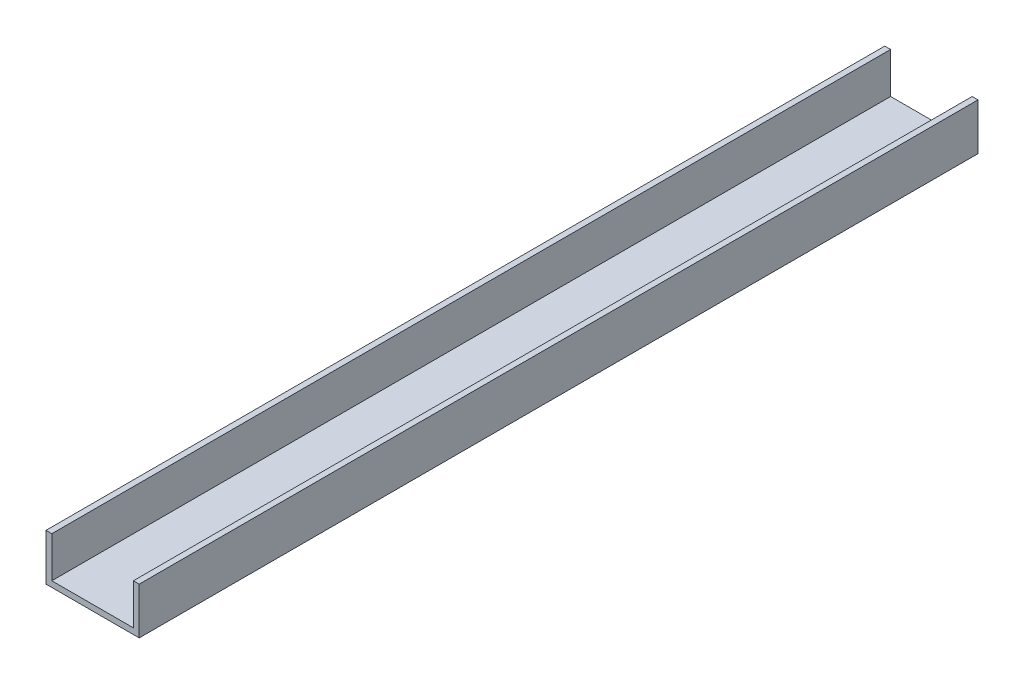
ISO-10303-21;
HEADER;
FILE_DESCRIPTION(('STEP AP214'),'2;1');
FILE_NAME('part.step','',(''),(''),'','','');
FILE_SCHEMA(('AUTOMOTIVE_DESIGN { 1 0 10303 214 1 1 1 1 }'));
ENDSEC;
DATA;
#1=APPLICATION_CONTEXT('core data for automotive mechanical design processes');
#2=APPLICATION_PROTOCOL_DEFINITION('international standard','automotive_design',2000,#1);
#3=PRODUCT_CONTEXT('',#1,'mechanical');
#4=PRODUCT('Part','Part','',(#3));
#5=PRODUCT_RELATED_PRODUCT_CATEGORY('part','',(#4));
#6=PRODUCT_DEFINITION_FORMATION('','',#4);
#7=PRODUCT_DEFINITION_CONTEXT('part definition',#1,'design');
#8=PRODUCT_DEFINITION('design','',#6,#7);
#9=PRODUCT_DEFINITION_SHAPE('','',#8);
#10=(LENGTH_UNIT() NAMED_UNIT(*) SI_UNIT(.MILLI.,.METRE.));
#11=(NAMED_UNIT(*) PLANE_ANGLE_UNIT() SI_UNIT($,.RADIAN.));
#12=(NAMED_UNIT(*) SI_UNIT($,.STERADIAN.) SOLID_ANGLE_UNIT());
#13=UNCERTAINTY_MEASURE_WITH_UNIT(LENGTH_MEASURE(1.E-05),#10,'distance_accuracy_value','');
#14=(GEOMETRIC_REPRESENTATION_CONTEXT(3) GLOBAL_UNCERTAINTY_ASSIGNED_CONTEXT((#13)) GLOBAL_UNIT_ASSIGNED_CONTEXT((#10,
#11,#12)) REPRESENTATION_CONTEXT('',''));
#15=CARTESIAN_POINT('',(0.,0.,0.));
#16=DIRECTION('',(0.,0.,1.));
#17=DIRECTION('',(1.,0.,0.));
#18=AXIS2_PLACEMENT_3D('',#15,#16,#17);
#19=CARTESIAN_POINT('',(0.,0.,457.2));
#20=DIRECTION('',(1.,0.,0.));
#21=DIRECTION('',(0.,0.,-1.));
#22=AXIS2_PLACEMENT_3D('',#19,#20,#21);
#23=PLANE('',#22);
#24=DIRECTION('',(0.,-1.,0.));
#25=VECTOR('',#24,1.);
#26=CARTESIAN_POINT('',(0.,0.,0.));
#27=LINE('',#26,#25);
#28=CARTESIAN_POINT('',(0.,25.4,0.));
#29=VERTEX_POINT('',#28);
#30=CARTESIAN_POINT('',(0.,0.,0.));
#31=VERTEX_POINT('',#30);
#32=EDGE_CURVE('E150',#29,#31,#27,.T.);
#33=ORIENTED_EDGE('',*,*,#32,.T.);
#34=DIRECTION('',(0.,0.,-1.));
#35=VECTOR('',#34,1.);
#36=CARTESIAN_POINT('',(0.,0.,457.2));
#37=LINE('',#36,#35);
#38=CARTESIAN_POINT('',(0.,0.,457.2));
#39=VERTEX_POINT('',#38);
#40=EDGE_CURVE('E11',#39,#31,#37,.T.);
#41=ORIENTED_EDGE('',*,*,#40,.F.);
#42=DIRECTION('',(0.,-1.,0.));
#43=VECTOR('',#42,1.);
#44=CARTESIAN_POINT('',(0.,0.,457.2));
#45=LINE('',#44,#43);
#46=CARTESIAN_POINT('',(0.,25.4,457.2));
#47=VERTEX_POINT('',#46);
#48=EDGE_CURVE('E169',#47,#39,#45,.T.);
#49=ORIENTED_EDGE('',*,*,#48,.F.);
#50=DIRECTION('',(0.,0.,-1.));
#51=VECTOR('',#50,1.);
#52=CARTESIAN_POINT('',(0.,25.4,457.2));
#53=LINE('',#52,#51);
#54=EDGE_CURVE('E146',#47,#29,#53,.T.);
#55=ORIENTED_EDGE('',*,*,#54,.T.);
#56=EDGE_LOOP('',(#33,#41,#49,#55));
#57=FACE_BOUND('',#56,.T.);
#58=ADVANCED_FACE('F40',(#57),#23,.F.);
#59=CARTESIAN_POINT('',(0.,0.,457.2));
#60=DIRECTION('',(0.,1.,0.));
#61=DIRECTION('',(0.,0.,1.));
#62=AXIS2_PLACEMENT_3D('',#59,#60,#61);
#63=PLANE('',#62);
#64=DIRECTION('',(1.,0.,0.));
#65=VECTOR('',#64,1.);
#66=CARTESIAN_POINT('',(0.,0.,0.));
#67=LINE('',#66,#65);
#68=CARTESIAN_POINT('',(50.8,0.,0.));
#69=VERTEX_POINT('',#68);
#70=EDGE_CURVE('E153',#31,#69,#67,.T.);
#71=ORIENTED_EDGE('',*,*,#70,.T.);
#72=DIRECTION('',(0.,0.,-1.));
#73=VECTOR('',#72,1.);
#74=CARTESIAN_POINT('',(50.8,0.,457.2));
#75=LINE('',#74,#73);
#76=CARTESIAN_POINT('',(50.8,0.,457.2));
#77=VERTEX_POINT('',#76);
#78=EDGE_CURVE('E49',#77,#69,#75,.T.);
#79=ORIENTED_EDGE('',*,*,#78,.F.);
#80=DIRECTION('',(1.,0.,0.));
#81=VECTOR('',#80,1.);
#82=CARTESIAN_POINT('',(0.,0.,457.2));
#83=LINE('',#82,#81);
#84=EDGE_CURVE('E106',#39,#77,#83,.T.);
#85=ORIENTED_EDGE('',*,*,#84,.F.);
#86=ORIENTED_EDGE('',*,*,#40,.T.);
#87=EDGE_LOOP('',(#71,#79,#85,#86));
#88=FACE_BOUND('',#87,.T.);
#89=ADVANCED_FACE('F213',(#88),#63,.F.);
#90=CARTESIAN_POINT('',(50.8,0.,457.2));
#91=DIRECTION('',(-1.,0.,0.));
#92=DIRECTION('',(0.,0.,1.));
#93=AXIS2_PLACEMENT_3D('',#90,#91,#92);
#94=PLANE('',#93);
#95=DIRECTION('',(0.,1.,0.));
#96=VECTOR('',#95,1.);
#97=CARTESIAN_POINT('',(50.8,0.,0.));
#98=LINE('',#97,#96);
#99=CARTESIAN_POINT('',(50.8,25.4,0.));
#100=VERTEX_POINT('',#99);
#101=EDGE_CURVE('E156',#69,#100,#98,.T.);
#102=ORIENTED_EDGE('',*,*,#101,.T.);
#103=DIRECTION('',(0.,0.,-1.));
#104=VECTOR('',#103,1.);
#105=CARTESIAN_POINT('',(50.8,25.4,457.2));
#106=LINE('',#105,#104);
#107=CARTESIAN_POINT('',(50.8,25.4,457.2));
#108=VERTEX_POINT('',#107);
#109=EDGE_CURVE('E180',#108,#100,#106,.T.);
#110=ORIENTED_EDGE('',*,*,#109,.F.);
#111=DIRECTION('',(0.,1.,0.));
#112=VECTOR('',#111,1.);
#113=CARTESIAN_POINT('',(50.8,0.,457.2));
#114=LINE('',#113,#112);
#115=EDGE_CURVE('E190',#77,#108,#114,.T.);
#116=ORIENTED_EDGE('',*,*,#115,.F.);
#117=ORIENTED_EDGE('',*,*,#78,.T.);
#118=EDGE_LOOP('',(#102,#110,#116,#117));
#119=FACE_BOUND('',#118,.T.);
#120=ADVANCED_FACE('F188',(#119),#94,.F.);
#121=CARTESIAN_POINT('',(47.625,25.4,457.2));
#122=DIRECTION('',(0.,-1.,0.));
#123=DIRECTION('',(0.,0.,-1.));
#124=AXIS2_PLACEMENT_3D('',#121,#122,#123);
#125=PLANE('',#124);
#126=DIRECTION('',(-1.,0.,0.));
#127=VECTOR('',#126,1.);
#128=CARTESIAN_POINT('',(47.625,25.4,0.));
#129=LINE('',#128,#127);
#130=CARTESIAN_POINT('',(47.625,25.4,0.));
#131=VERTEX_POINT('',#130);
#132=EDGE_CURVE('E159',#100,#131,#129,.T.);
#133=ORIENTED_EDGE('',*,*,#132,.T.);
#134=DIRECTION('',(0.,0.,-1.));
#135=VECTOR('',#134,1.);
#136=CARTESIAN_POINT('',(47.625,25.4,457.2));
#137=LINE('',#136,#135);
#138=CARTESIAN_POINT('',(47.625,25.4,457.2));
#139=VERTEX_POINT('',#138);
#140=EDGE_CURVE('E176',#139,#131,#137,.T.);
#141=ORIENTED_EDGE('',*,*,#140,.F.);
#142=DIRECTION('',(-1.,0.,0.));
#143=VECTOR('',#142,1.);
#144=CARTESIAN_POINT('',(47.625,25.4,457.2));
#145=LINE('',#144,#143);
#146=EDGE_CURVE('E203',#108,#139,#145,.T.);
#147=ORIENTED_EDGE('',*,*,#146,.F.);
#148=ORIENTED_EDGE('',*,*,#109,.T.);
#149=EDGE_LOOP('',(#133,#141,#147,#148));
#150=FACE_BOUND('',#149,.T.);
#151=ADVANCED_FACE('F198',(#150),#125,.F.);
#152=CARTESIAN_POINT('',(47.625,3.175,457.2));
#153=DIRECTION('',(1.,0.,0.));
#154=DIRECTION('',(0.,0.,-1.));
#155=AXIS2_PLACEMENT_3D('',#152,#153,#154);
#156=PLANE('',#155);
#157=DIRECTION('',(0.,-1.,0.));
#158=VECTOR('',#157,1.);
#159=CARTESIAN_POINT('',(47.625,3.175,0.));
#160=LINE('',#159,#158);
#161=CARTESIAN_POINT('',(47.625,3.175,0.));
#162=VERTEX_POINT('',#161);
#163=EDGE_CURVE('E162',#131,#162,#160,.T.);
#164=ORIENTED_EDGE('',*,*,#163,.T.);
#165=DIRECTION('',(0.,0.,-1.));
#166=VECTOR('',#165,1.);
#167=CARTESIAN_POINT('',(47.625,3.175,457.2));
#168=LINE('',#167,#166);
#169=CARTESIAN_POINT('',(47.625,3.175,457.2));
#170=VERTEX_POINT('',#169);
#171=EDGE_CURVE('E138',#170,#162,#168,.T.);
#172=ORIENTED_EDGE('',*,*,#171,.F.);
#173=DIRECTION('',(0.,-1.,0.));
#174=VECTOR('',#173,1.);
#175=CARTESIAN_POINT('',(47.625,3.175,457.2));
#176=LINE('',#175,#174);
#177=EDGE_CURVE('E127',#139,#170,#176,.T.);
#178=ORIENTED_EDGE('',*,*,#177,.F.);
#179=ORIENTED_EDGE('',*,*,#140,.T.);
#180=EDGE_LOOP('',(#164,#172,#178,#179));
#181=FACE_BOUND('',#180,.T.);
#182=ADVANCED_FACE('F201',(#181),#156,.F.);
#183=CARTESIAN_POINT('',(3.175,3.175,457.2));
#184=DIRECTION('',(0.,-1.,0.));
#185=DIRECTION('',(0.,0.,-1.));
#186=AXIS2_PLACEMENT_3D('',#183,#184,#185);
#187=PLANE('',#186);
#188=DIRECTION('',(-1.,0.,0.));
#189=VECTOR('',#188,1.);
#190=CARTESIAN_POINT('',(3.175,3.175,0.));
#191=LINE('',#190,#189);
#192=CARTESIAN_POINT('',(3.175,3.175,0.));
#193=VERTEX_POINT('',#192);
#194=EDGE_CURVE('E136',#162,#193,#191,.T.);
#195=ORIENTED_EDGE('',*,*,#194,.T.);
#196=DIRECTION('',(0.,0.,-1.));
#197=VECTOR('',#196,1.);
#198=CARTESIAN_POINT('',(3.175,3.175,457.2));
#199=LINE('',#198,#197);
#200=CARTESIAN_POINT('',(3.175,3.175,457.2));
#201=VERTEX_POINT('',#200);
#202=EDGE_CURVE('E133',#201,#193,#199,.T.);
#203=ORIENTED_EDGE('',*,*,#202,.F.);
#204=DIRECTION('',(-1.,0.,0.));
#205=VECTOR('',#204,1.);
#206=CARTESIAN_POINT('',(3.175,3.175,457.2));
#207=LINE('',#206,#205);
#208=EDGE_CURVE('E121',#170,#201,#207,.T.);
#209=ORIENTED_EDGE('',*,*,#208,.F.);
#210=ORIENTED_EDGE('',*,*,#171,.T.);
#211=EDGE_LOOP('',(#195,#203,#209,#210));
#212=FACE_BOUND('',#211,.T.);
#213=ADVANCED_FACE('F134',(#212),#187,.F.);
#214=CARTESIAN_POINT('',(3.175,3.175,457.2));
#215=DIRECTION('',(-1.,0.,0.));
#216=DIRECTION('',(0.,-1.,0.));
#217=AXIS2_PLACEMENT_3D('',#214,#215,#216);
#218=PLANE('',#217);
#219=DIRECTION('',(0.,1.,0.));
#220=VECTOR('',#219,1.);
#221=CARTESIAN_POINT('',(3.175,3.175,0.));
#222=LINE('',#221,#220);
#223=CARTESIAN_POINT('',(3.175,25.4,0.));
#224=VERTEX_POINT('',#223);
#225=EDGE_CURVE('E92',#193,#224,#222,.T.);
#226=ORIENTED_EDGE('',*,*,#225,.T.);
#227=DIRECTION('',(0.,0.,-1.));
#228=VECTOR('',#227,1.);
#229=CARTESIAN_POINT('',(3.175,25.4,457.2));
#230=LINE('',#229,#228);
#231=CARTESIAN_POINT('',(3.175,25.4,457.2));
#232=VERTEX_POINT('',#231);
#233=EDGE_CURVE('E139',#232,#224,#230,.T.);
#234=ORIENTED_EDGE('',*,*,#233,.F.);
#235=DIRECTION('',(0.,1.,0.));
#236=VECTOR('',#235,1.);
#237=CARTESIAN_POINT('',(3.175,3.175,457.2));
#238=LINE('',#237,#236);
#239=EDGE_CURVE('E125',#201,#232,#238,.T.);
#240=ORIENTED_EDGE('',*,*,#239,.F.);
#241=ORIENTED_EDGE('',*,*,#202,.T.);
#242=EDGE_LOOP('',(#226,#234,#240,#241));
#243=FACE_BOUND('',#242,.T.);
#244=ADVANCED_FACE('F141',(#243),#218,.F.);
#245=CARTESIAN_POINT('',(0.,25.4,457.2));
#246=DIRECTION('',(0.,-1.,0.));
#247=DIRECTION('',(0.,0.,-1.));
#248=AXIS2_PLACEMENT_3D('',#245,#246,#247);
#249=PLANE('',#248);
#250=DIRECTION('',(-1.,0.,0.));
#251=VECTOR('',#250,1.);
#252=CARTESIAN_POINT('',(0.,25.4,0.));
#253=LINE('',#252,#251);
#254=EDGE_CURVE('E98',#224,#29,#253,.T.);
#255=ORIENTED_EDGE('',*,*,#254,.T.);
#256=ORIENTED_EDGE('',*,*,#54,.F.);
#257=DIRECTION('',(-1.,0.,0.));
#258=VECTOR('',#257,1.);
#259=CARTESIAN_POINT('',(0.,25.4,457.2));
#260=LINE('',#259,#258);
#261=EDGE_CURVE('E59',#232,#47,#260,.T.);
#262=ORIENTED_EDGE('',*,*,#261,.F.);
#263=ORIENTED_EDGE('',*,*,#233,.T.);
#264=EDGE_LOOP('',(#255,#256,#262,#263));
#265=FACE_BOUND('',#264,.T.);
#266=ADVANCED_FACE('F229',(#265),#249,.F.);
#267=CARTESIAN_POINT('',(0.,0.,457.2));
#268=DIRECTION('',(0.,0.,-1.));
#269=DIRECTION('',(-1.,0.,0.));
#270=AXIS2_PLACEMENT_3D('',#267,#268,#269);
#271=PLANE('',#270);
#272=ORIENTED_EDGE('',*,*,#48,.T.);
#273=ORIENTED_EDGE('',*,*,#84,.T.);
#274=ORIENTED_EDGE('',*,*,#115,.T.);
#275=ORIENTED_EDGE('',*,*,#146,.T.);
#276=ORIENTED_EDGE('',*,*,#177,.T.);
#277=ORIENTED_EDGE('',*,*,#208,.T.);
#278=ORIENTED_EDGE('',*,*,#239,.T.);
#279=ORIENTED_EDGE('',*,*,#261,.T.);
#280=EDGE_LOOP('',(#272,#273,#274,#275,#276,#277,#278,#279));
#281=FACE_BOUND('',#280,.T.);
#282=ADVANCED_FACE('F123',(#281),#271,.F.);
#283=CARTESIAN_POINT('',(0.,0.,0.));
#284=DIRECTION('',(0.,0.,-1.));
#285=DIRECTION('',(-1.,0.,0.));
#286=AXIS2_PLACEMENT_3D('',#283,#284,#285);
#287=PLANE('',#286);
#288=ORIENTED_EDGE('',*,*,#32,.F.);
#289=ORIENTED_EDGE('',*,*,#254,.F.);
#290=ORIENTED_EDGE('',*,*,#225,.F.);
#291=ORIENTED_EDGE('',*,*,#194,.F.);
#292=ORIENTED_EDGE('',*,*,#163,.F.);
#293=ORIENTED_EDGE('',*,*,#132,.F.);
#294=ORIENTED_EDGE('',*,*,#101,.F.);
#295=ORIENTED_EDGE('',*,*,#70,.F.);
#296=EDGE_LOOP('',(#288,#289,#290,#291,#292,#293,#294,#295));
#297=FACE_BOUND('',#296,.T.);
#298=ADVANCED_FACE('F194',(#297),#287,.T.);
#299=CLOSED_SHELL('',(#58,#89,#120,#151,#182,#213,#244,#266,#282,#298));
#300=MANIFOLD_SOLID_BREP('B2',#299);
#301=ADVANCED_BREP_SHAPE_REPRESENTATION('',(#18,#300),#14);
#302=SHAPE_DEFINITION_REPRESENTATION(#9,#301);
ENDSEC;
END-ISO-10303-21;
